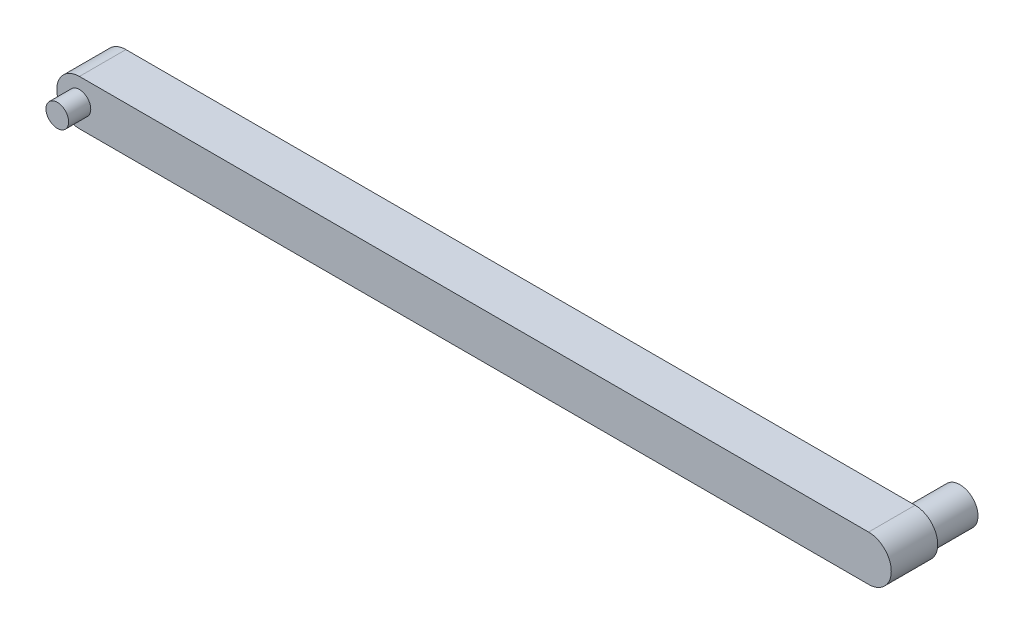
ISO-10303-21;
HEADER;
FILE_DESCRIPTION(('STEP AP214'),'2;1');
FILE_NAME('part.step','',(''),(''),'','','');
FILE_SCHEMA(('AUTOMOTIVE_DESIGN { 1 0 10303 214 1 1 1 1 }'));
ENDSEC;
DATA;
#1=APPLICATION_CONTEXT('core data for automotive mechanical design processes');
#2=APPLICATION_PROTOCOL_DEFINITION('international standard','automotive_design',2000,#1);
#3=PRODUCT_CONTEXT('',#1,'mechanical');
#4=PRODUCT('Part','Part','',(#3));
#5=PRODUCT_RELATED_PRODUCT_CATEGORY('part','',(#4));
#6=PRODUCT_DEFINITION_FORMATION('','',#4);
#7=PRODUCT_DEFINITION_CONTEXT('part definition',#1,'design');
#8=PRODUCT_DEFINITION('design','',#6,#7);
#9=PRODUCT_DEFINITION_SHAPE('','',#8);
#10=(LENGTH_UNIT() NAMED_UNIT(*) SI_UNIT(.MILLI.,.METRE.));
#11=(NAMED_UNIT(*) PLANE_ANGLE_UNIT() SI_UNIT($,.RADIAN.));
#12=(NAMED_UNIT(*) SI_UNIT($,.STERADIAN.) SOLID_ANGLE_UNIT());
#13=UNCERTAINTY_MEASURE_WITH_UNIT(LENGTH_MEASURE(1.E-05),#10,'distance_accuracy_value','');
#14=(GEOMETRIC_REPRESENTATION_CONTEXT(3) GLOBAL_UNCERTAINTY_ASSIGNED_CONTEXT((#13)) GLOBAL_UNIT_ASSIGNED_CONTEXT((#10,
#11,#12)) REPRESENTATION_CONTEXT('',''));
#15=CARTESIAN_POINT('',(0.,0.,0.));
#16=DIRECTION('',(0.,0.,1.));
#17=DIRECTION('',(1.,0.,0.));
#18=AXIS2_PLACEMENT_3D('',#15,#16,#17);
#19=CARTESIAN_POINT('',(-28.7901893616651,1.6030534351145,5.125));
#20=DIRECTION('',(0.,0.,-1.));
#21=DIRECTION('',(-1.,0.,0.));
#22=AXIS2_PLACEMENT_3D('',#19,#20,#21);
#23=CYLINDRICAL_SURFACE('',#22,5.);
#24=CARTESIAN_POINT('',(-28.7901893616651,1.6030534351145,-5.125));
#25=DIRECTION('',(0.,0.,1.));
#26=DIRECTION('',(1.,0.,0.));
#27=AXIS2_PLACEMENT_3D('',#24,#25,#26);
#28=CIRCLE('',#27,5.);
#29=CARTESIAN_POINT('',(-28.7901893616651,6.6030534351145,-5.125));
#30=VERTEX_POINT('',#29);
#31=CARTESIAN_POINT('',(-28.7901893616651,-3.3969465648855,-5.125));
#32=VERTEX_POINT('',#31);
#33=EDGE_CURVE('E110',#30,#32,#28,.T.);
#34=ORIENTED_EDGE('',*,*,#33,.T.);
#35=DIRECTION('',(0.,0.,-1.));
#36=VECTOR('',#35,1.);
#37=CARTESIAN_POINT('',(-28.7901893616651,-3.3969465648855,5.125));
#38=LINE('',#37,#36);
#39=CARTESIAN_POINT('',(-28.7901893616651,-3.3969465648855,5.125));
#40=VERTEX_POINT('',#39);
#41=EDGE_CURVE('E11',#40,#32,#38,.T.);
#42=ORIENTED_EDGE('',*,*,#41,.F.);
#43=CARTESIAN_POINT('',(-28.7901893616651,1.6030534351145,5.125));
#44=DIRECTION('',(0.,0.,1.));
#45=DIRECTION('',(1.,0.,0.));
#46=AXIS2_PLACEMENT_3D('',#43,#44,#45);
#47=CIRCLE('',#46,5.);
#48=CARTESIAN_POINT('',(-28.7901893616651,6.6030534351145,5.125));
#49=VERTEX_POINT('',#48);
#50=EDGE_CURVE('E93',#49,#40,#47,.T.);
#51=ORIENTED_EDGE('',*,*,#50,.F.);
#52=DIRECTION('',(0.,0.,-1.));
#53=VECTOR('',#52,1.);
#54=CARTESIAN_POINT('',(-28.7901893616651,6.6030534351145,5.125));
#55=LINE('',#54,#53);
#56=EDGE_CURVE('E106',#49,#30,#55,.T.);
#57=ORIENTED_EDGE('',*,*,#56,.T.);
#58=EDGE_LOOP('',(#34,#42,#51,#57));
#59=FACE_BOUND('',#58,.T.);
#60=ADVANCED_FACE('F39',(#59),#23,.T.);
#61=CARTESIAN_POINT('',(-28.7901893616651,-3.3969465648855,5.125));
#62=DIRECTION('',(0.,1.,0.));
#63=DIRECTION('',(0.,0.,1.));
#64=AXIS2_PLACEMENT_3D('',#61,#62,#63);
#65=PLANE('',#64);
#66=DIRECTION('',(1.,0.,0.));
#67=VECTOR('',#66,1.);
#68=CARTESIAN_POINT('',(-28.7901893616651,-3.3969465648855,-5.125));
#69=LINE('',#68,#67);
#70=CARTESIAN_POINT('',(145.209810638335,-3.3969465648855,-5.125));
#71=VERTEX_POINT('',#70);
#72=EDGE_CURVE('E98',#32,#71,#69,.T.);
#73=ORIENTED_EDGE('',*,*,#72,.T.);
#74=DIRECTION('',(0.,0.,-1.));
#75=VECTOR('',#74,1.);
#76=CARTESIAN_POINT('',(145.209810638335,-3.3969465648855,5.125));
#77=LINE('',#76,#75);
#78=CARTESIAN_POINT('',(145.209810638335,-3.3969465648855,5.125));
#79=VERTEX_POINT('',#78);
#80=EDGE_CURVE('E49',#79,#71,#77,.T.);
#81=ORIENTED_EDGE('',*,*,#80,.F.);
#82=DIRECTION('',(1.,0.,0.));
#83=VECTOR('',#82,1.);
#84=CARTESIAN_POINT('',(-28.7901893616651,-3.3969465648855,5.125));
#85=LINE('',#84,#83);
#86=EDGE_CURVE('E88',#40,#79,#85,.T.);
#87=ORIENTED_EDGE('',*,*,#86,.F.);
#88=ORIENTED_EDGE('',*,*,#41,.T.);
#89=EDGE_LOOP('',(#73,#81,#87,#88));
#90=FACE_BOUND('',#89,.T.);
#91=ADVANCED_FACE('F97',(#90),#65,.F.);
#92=CARTESIAN_POINT('',(145.209810638335,1.6030534351145,5.125));
#93=DIRECTION('',(0.,0.,-1.));
#94=DIRECTION('',(-1.,0.,0.));
#95=AXIS2_PLACEMENT_3D('',#92,#93,#94);
#96=CYLINDRICAL_SURFACE('',#95,5.);
#97=CARTESIAN_POINT('',(145.209810638335,1.6030534351145,-5.125));
#98=DIRECTION('',(0.,0.,1.));
#99=DIRECTION('',(1.,0.,0.));
#100=AXIS2_PLACEMENT_3D('',#97,#98,#99);
#101=CIRCLE('',#100,5.);
#102=CARTESIAN_POINT('',(145.209810638335,6.6030534351145,-5.125));
#103=VERTEX_POINT('',#102);
#104=EDGE_CURVE('E75',#71,#103,#101,.T.);
#105=ORIENTED_EDGE('',*,*,#104,.T.);
#106=DIRECTION('',(0.,0.,-1.));
#107=VECTOR('',#106,1.);
#108=CARTESIAN_POINT('',(145.209810638335,6.6030534351145,5.125));
#109=LINE('',#108,#107);
#110=CARTESIAN_POINT('',(145.209810638335,6.6030534351145,5.125));
#111=VERTEX_POINT('',#110);
#112=EDGE_CURVE('E100',#111,#103,#109,.T.);
#113=ORIENTED_EDGE('',*,*,#112,.F.);
#114=CARTESIAN_POINT('',(145.209810638335,1.6030534351145,5.125));
#115=DIRECTION('',(0.,0.,1.));
#116=DIRECTION('',(1.,0.,0.));
#117=AXIS2_PLACEMENT_3D('',#114,#115,#116);
#118=CIRCLE('',#117,5.);
#119=EDGE_CURVE('E91',#79,#111,#118,.T.);
#120=ORIENTED_EDGE('',*,*,#119,.F.);
#121=ORIENTED_EDGE('',*,*,#80,.T.);
#122=EDGE_LOOP('',(#105,#113,#120,#121));
#123=FACE_BOUND('',#122,.T.);
#124=ADVANCED_FACE('F102',(#123),#96,.T.);
#125=CARTESIAN_POINT('',(-28.7901893616651,6.6030534351145,5.125));
#126=DIRECTION('',(0.,-1.,0.));
#127=DIRECTION('',(1.,0.,0.));
#128=AXIS2_PLACEMENT_3D('',#125,#126,#127);
#129=PLANE('',#128);
#130=DIRECTION('',(-1.,0.,0.));
#131=VECTOR('',#130,1.);
#132=CARTESIAN_POINT('',(-28.7901893616651,6.6030534351145,-5.125));
#133=LINE('',#132,#131);
#134=EDGE_CURVE('E81',#103,#30,#133,.T.);
#135=ORIENTED_EDGE('',*,*,#134,.T.);
#136=ORIENTED_EDGE('',*,*,#56,.F.);
#137=DIRECTION('',(-1.,0.,0.));
#138=VECTOR('',#137,1.);
#139=CARTESIAN_POINT('',(-28.7901893616651,6.6030534351145,5.125));
#140=LINE('',#139,#138);
#141=EDGE_CURVE('E58',#111,#49,#140,.T.);
#142=ORIENTED_EDGE('',*,*,#141,.F.);
#143=ORIENTED_EDGE('',*,*,#112,.T.);
#144=EDGE_LOOP('',(#135,#136,#142,#143));
#145=FACE_BOUND('',#144,.T.);
#146=ADVANCED_FACE('F172',(#145),#129,.F.);
#147=CARTESIAN_POINT('',(-28.7901893616651,1.6030534351145,5.125));
#148=DIRECTION('',(0.,0.,1.));
#149=DIRECTION('',(1.,0.,0.));
#150=AXIS2_PLACEMENT_3D('',#147,#148,#149);
#151=PLANE('',#150);
#152=CARTESIAN_POINT('',(-28.7901893616651,1.6030534351145,5.125));
#153=DIRECTION('',(0.,0.,1.));
#154=DIRECTION('',(1.,0.,0.));
#155=AXIS2_PLACEMENT_3D('',#152,#153,#154);
#156=CIRCLE('',#155,2.5);
#157=CARTESIAN_POINT('',(-26.2901893616651,1.6030534351145,5.125));
#158=VERTEX_POINT('',#157);
#159=EDGE_CURVE('E114',#158,#158,#156,.F.);
#160=ORIENTED_EDGE('',*,*,#159,.T.);
#161=EDGE_LOOP('',(#160));
#162=FACE_BOUND('',#161,.T.);
#163=ORIENTED_EDGE('',*,*,#50,.T.);
#164=ORIENTED_EDGE('',*,*,#86,.T.);
#165=ORIENTED_EDGE('',*,*,#119,.T.);
#166=ORIENTED_EDGE('',*,*,#141,.T.);
#167=EDGE_LOOP('',(#163,#164,#165,#166));
#168=FACE_BOUND('',#167,.T.);
#169=ADVANCED_FACE('F89',(#162,#168),#151,.T.);
#170=CARTESIAN_POINT('',(-28.7901893616651,1.6030534351145,-5.125));
#171=DIRECTION('',(0.,0.,1.));
#172=DIRECTION('',(1.,0.,0.));
#173=AXIS2_PLACEMENT_3D('',#170,#171,#172);
#174=PLANE('',#173);
#175=CARTESIAN_POINT('',(145.209810638335,1.6030534351145,-5.125));
#176=DIRECTION('',(0.,0.,1.));
#177=DIRECTION('',(1.,0.,0.));
#178=AXIS2_PLACEMENT_3D('',#175,#176,#177);
#179=CIRCLE('',#178,3.99999999999999);
#180=CARTESIAN_POINT('',(149.209810638335,1.6030534351145,-5.125));
#181=VERTEX_POINT('',#180);
#182=EDGE_CURVE('E42',#181,#181,#179,.T.);
#183=ORIENTED_EDGE('',*,*,#182,.T.);
#184=EDGE_LOOP('',(#183));
#185=FACE_BOUND('',#184,.T.);
#186=ORIENTED_EDGE('',*,*,#33,.F.);
#187=ORIENTED_EDGE('',*,*,#134,.F.);
#188=ORIENTED_EDGE('',*,*,#104,.F.);
#189=ORIENTED_EDGE('',*,*,#72,.F.);
#190=EDGE_LOOP('',(#186,#187,#188,#189));
#191=FACE_BOUND('',#190,.T.);
#192=ADVANCED_FACE('F161',(#185,#191),#174,.F.);
#193=CARTESIAN_POINT('',(-28.7901893616651,1.6030534351145,10.));
#194=DIRECTION('',(0.,0.,-1.));
#195=DIRECTION('',(-1.,0.,0.));
#196=AXIS2_PLACEMENT_3D('',#193,#194,#195);
#197=CYLINDRICAL_SURFACE('',#196,2.5);
#198=ORIENTED_EDGE('',*,*,#159,.F.);
#199=EDGE_LOOP('',(#198));
#200=FACE_BOUND('',#199,.T.);
#201=CARTESIAN_POINT('',(-28.7901893616651,1.6030534351145,10.));
#202=DIRECTION('',(0.,0.,1.));
#203=DIRECTION('',(1.,0.,0.));
#204=AXIS2_PLACEMENT_3D('',#201,#202,#203);
#205=CIRCLE('',#204,2.5);
#206=CARTESIAN_POINT('',(-26.2901893616651,1.6030534351145,10.));
#207=VERTEX_POINT('',#206);
#208=EDGE_CURVE('E126',#207,#207,#205,.T.);
#209=ORIENTED_EDGE('',*,*,#208,.F.);
#210=EDGE_LOOP('',(#209));
#211=FACE_BOUND('',#210,.T.);
#212=ADVANCED_FACE('F163',(#200,#211),#197,.T.);
#213=CARTESIAN_POINT('',(-28.7901893616651,1.6030534351145,10.));
#214=DIRECTION('',(0.,0.,1.));
#215=DIRECTION('',(1.,0.,0.));
#216=AXIS2_PLACEMENT_3D('',#213,#214,#215);
#217=PLANE('',#216);
#218=ORIENTED_EDGE('',*,*,#208,.T.);
#219=EDGE_LOOP('',(#218));
#220=FACE_BOUND('',#219,.T.);
#221=ADVANCED_FACE('F152',(#220),#217,.T.);
#222=CARTESIAN_POINT('',(145.209810638335,1.6030534351145,-15.));
#223=DIRECTION('',(0.,0.,1.));
#224=DIRECTION('',(1.,0.,0.));
#225=AXIS2_PLACEMENT_3D('',#222,#223,#224);
#226=CYLINDRICAL_SURFACE('',#225,3.99999999999999);
#227=CARTESIAN_POINT('',(145.209810638335,1.6030534351145,-15.));
#228=DIRECTION('',(0.,0.,1.));
#229=DIRECTION('',(1.,0.,0.));
#230=AXIS2_PLACEMENT_3D('',#227,#228,#229);
#231=CIRCLE('',#230,3.99999999999999);
#232=CARTESIAN_POINT('',(149.209810638335,1.6030534351145,-15.));
#233=VERTEX_POINT('',#232);
#234=EDGE_CURVE('E136',#233,#233,#231,.T.);
#235=ORIENTED_EDGE('',*,*,#234,.T.);
#236=EDGE_LOOP('',(#235));
#237=FACE_BOUND('',#236,.T.);
#238=ORIENTED_EDGE('',*,*,#182,.F.);
#239=EDGE_LOOP('',(#238));
#240=FACE_BOUND('',#239,.T.);
#241=ADVANCED_FACE('F143',(#237,#240),#226,.T.);
#242=CARTESIAN_POINT('',(145.209810638335,1.6030534351145,-15.));
#243=DIRECTION('',(0.,0.,1.));
#244=DIRECTION('',(1.,0.,0.));
#245=AXIS2_PLACEMENT_3D('',#242,#243,#244);
#246=PLANE('',#245);
#247=ORIENTED_EDGE('',*,*,#234,.F.);
#248=EDGE_LOOP('',(#247));
#249=FACE_BOUND('',#248,.T.);
#250=ADVANCED_FACE('F146',(#249),#246,.F.);
#251=CLOSED_SHELL('',(#60,#91,#124,#146,#169,#192,#212,#221,#241,#250));
#252=MANIFOLD_SOLID_BREP('B2',#251);
#253=ADVANCED_BREP_SHAPE_REPRESENTATION('',(#18,#252),#14);
#254=SHAPE_DEFINITION_REPRESENTATION(#9,#253);
ENDSEC;
END-ISO-10303-21;
